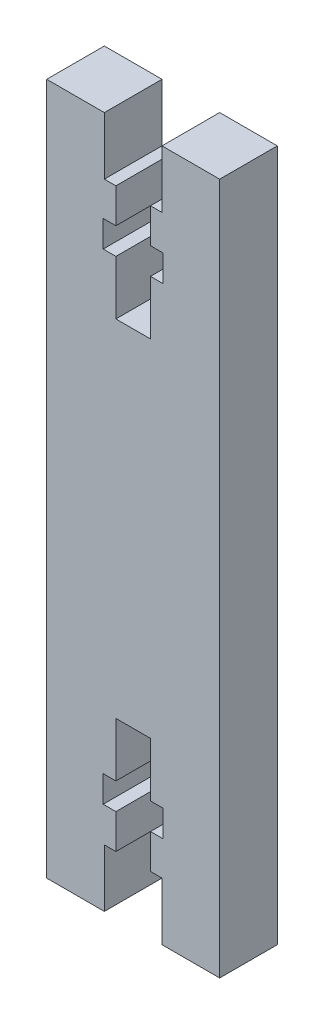
ISO-10303-21;
HEADER;
FILE_DESCRIPTION(('STEP AP214'),'2;1');
FILE_NAME('part.step','',(''),(''),'','','');
FILE_SCHEMA(('AUTOMOTIVE_DESIGN { 1 0 10303 214 1 1 1 1 }'));
ENDSEC;
DATA;
#1=APPLICATION_CONTEXT('core data for automotive mechanical design processes');
#2=APPLICATION_PROTOCOL_DEFINITION('international standard','automotive_design',2000,#1);
#3=PRODUCT_CONTEXT('',#1,'mechanical');
#4=PRODUCT('Part','Part','',(#3));
#5=PRODUCT_RELATED_PRODUCT_CATEGORY('part','',(#4));
#6=PRODUCT_DEFINITION_FORMATION('','',#4);
#7=PRODUCT_DEFINITION_CONTEXT('part definition',#1,'design');
#8=PRODUCT_DEFINITION('design','',#6,#7);
#9=PRODUCT_DEFINITION_SHAPE('','',#8);
#10=(LENGTH_UNIT() NAMED_UNIT(*) SI_UNIT(.MILLI.,.METRE.));
#11=(NAMED_UNIT(*) PLANE_ANGLE_UNIT() SI_UNIT($,.RADIAN.));
#12=(NAMED_UNIT(*) SI_UNIT($,.STERADIAN.) SOLID_ANGLE_UNIT());
#13=UNCERTAINTY_MEASURE_WITH_UNIT(LENGTH_MEASURE(1.E-05),#10,'distance_accuracy_value','');
#14=(GEOMETRIC_REPRESENTATION_CONTEXT(3) GLOBAL_UNCERTAINTY_ASSIGNED_CONTEXT((#13)) GLOBAL_UNIT_ASSIGNED_CONTEXT((#10,
#11,#12)) REPRESENTATION_CONTEXT('',''));
#15=CARTESIAN_POINT('',(0.,0.,0.));
#16=DIRECTION('',(0.,0.,1.));
#17=DIRECTION('',(1.,0.,0.));
#18=AXIS2_PLACEMENT_3D('',#15,#16,#17);
#19=CARTESIAN_POINT('',(-7.50000000000001,0.,5.));
#20=DIRECTION('',(-1.,0.,0.));
#21=DIRECTION('',(0.,0.,1.));
#22=AXIS2_PLACEMENT_3D('',#19,#20,#21);
#23=PLANE('',#22);
#24=DIRECTION('',(0.,1.,0.));
#25=VECTOR('',#24,1.);
#26=CARTESIAN_POINT('',(-7.50000000000001,0.,0.));
#27=LINE('',#26,#25);
#28=CARTESIAN_POINT('',(-7.5,-5.,0.));
#29=VERTEX_POINT('',#28);
#30=CARTESIAN_POINT('',(-7.49999999999998,55.,0.));
#31=VERTEX_POINT('',#30);
#32=EDGE_CURVE('E297',#29,#31,#27,.T.);
#33=ORIENTED_EDGE('',*,*,#32,.F.);
#34=DIRECTION('',(0.,0.,-1.));
#35=VECTOR('',#34,1.);
#36=CARTESIAN_POINT('',(-7.5,-5.,5.));
#37=LINE('',#36,#35);
#38=CARTESIAN_POINT('',(-7.5,-5.,5.));
#39=VERTEX_POINT('',#38);
#40=EDGE_CURVE('E11',#39,#29,#37,.T.);
#41=ORIENTED_EDGE('',*,*,#40,.F.);
#42=DIRECTION('',(0.,1.,0.));
#43=VECTOR('',#42,1.);
#44=CARTESIAN_POINT('',(-7.50000000000001,0.,5.));
#45=LINE('',#44,#43);
#46=CARTESIAN_POINT('',(-7.49999999999998,55.,5.));
#47=VERTEX_POINT('',#46);
#48=EDGE_CURVE('E391',#39,#47,#45,.T.);
#49=ORIENTED_EDGE('',*,*,#48,.T.);
#50=DIRECTION('',(0.,0.,-1.));
#51=VECTOR('',#50,1.);
#52=CARTESIAN_POINT('',(-7.49999999999998,55.,5.));
#53=LINE('',#52,#51);
#54=EDGE_CURVE('E169',#47,#31,#53,.T.);
#55=ORIENTED_EDGE('',*,*,#54,.T.);
#56=EDGE_LOOP('',(#33,#41,#49,#55));
#57=FACE_BOUND('',#56,.T.);
#58=ADVANCED_FACE('F35',(#57),#23,.T.);
#59=CARTESIAN_POINT('',(0.,-5.,5.));
#60=DIRECTION('',(0.,-1.,0.));
#61=DIRECTION('',(1.,0.,0.));
#62=AXIS2_PLACEMENT_3D('',#59,#60,#61);
#63=PLANE('',#62);
#64=DIRECTION('',(-1.,0.,0.));
#65=VECTOR('',#64,1.);
#66=CARTESIAN_POINT('',(0.,-5.,0.));
#67=LINE('',#66,#65);
#68=CARTESIAN_POINT('',(-2.5,-5.,0.));
#69=VERTEX_POINT('',#68);
#70=EDGE_CURVE('E300',#69,#29,#67,.T.);
#71=ORIENTED_EDGE('',*,*,#70,.F.);
#72=DIRECTION('',(0.,0.,-1.));
#73=VECTOR('',#72,1.);
#74=CARTESIAN_POINT('',(-2.5,-5.,5.));
#75=LINE('',#74,#73);
#76=CARTESIAN_POINT('',(-2.5,-5.,5.));
#77=VERTEX_POINT('',#76);
#78=EDGE_CURVE('E43',#77,#69,#75,.T.);
#79=ORIENTED_EDGE('',*,*,#78,.F.);
#80=DIRECTION('',(-1.,0.,0.));
#81=VECTOR('',#80,1.);
#82=CARTESIAN_POINT('',(0.,-5.,5.));
#83=LINE('',#82,#81);
#84=EDGE_CURVE('E477',#77,#39,#83,.T.);
#85=ORIENTED_EDGE('',*,*,#84,.T.);
#86=ORIENTED_EDGE('',*,*,#40,.T.);
#87=EDGE_LOOP('',(#71,#79,#85,#86));
#88=FACE_BOUND('',#87,.T.);
#89=ADVANCED_FACE('F476',(#88),#63,.T.);
#90=CARTESIAN_POINT('',(-2.5,0.,5.));
#91=DIRECTION('',(-1.,0.,0.));
#92=DIRECTION('',(0.,-1.,0.));
#93=AXIS2_PLACEMENT_3D('',#90,#91,#92);
#94=PLANE('',#93);
#95=DIRECTION('',(0.,1.,0.));
#96=VECTOR('',#95,1.);
#97=CARTESIAN_POINT('',(-2.5,0.,0.));
#98=LINE('',#97,#96);
#99=CARTESIAN_POINT('',(-2.5,0.,0.));
#100=VERTEX_POINT('',#99);
#101=EDGE_CURVE('E303',#69,#100,#98,.T.);
#102=ORIENTED_EDGE('',*,*,#101,.T.);
#103=DIRECTION('',(0.,0.,-1.));
#104=VECTOR('',#103,1.);
#105=CARTESIAN_POINT('',(-2.5,0.,5.));
#106=LINE('',#105,#104);
#107=CARTESIAN_POINT('',(-2.5,0.,5.));
#108=VERTEX_POINT('',#107);
#109=EDGE_CURVE('E462',#108,#100,#106,.T.);
#110=ORIENTED_EDGE('',*,*,#109,.F.);
#111=DIRECTION('',(0.,1.,0.));
#112=VECTOR('',#111,1.);
#113=CARTESIAN_POINT('',(-2.5,0.,5.));
#114=LINE('',#113,#112);
#115=EDGE_CURVE('E468',#77,#108,#114,.T.);
#116=ORIENTED_EDGE('',*,*,#115,.F.);
#117=ORIENTED_EDGE('',*,*,#78,.T.);
#118=EDGE_LOOP('',(#102,#110,#116,#117));
#119=FACE_BOUND('',#118,.T.);
#120=ADVANCED_FACE('F466',(#119),#94,.F.);
#121=CARTESIAN_POINT('',(0.,0.,5.));
#122=DIRECTION('',(0.,-1.,0.));
#123=DIRECTION('',(1.,0.,0.));
#124=AXIS2_PLACEMENT_3D('',#121,#122,#123);
#125=PLANE('',#124);
#126=DIRECTION('',(-1.,0.,0.));
#127=VECTOR('',#126,1.);
#128=CARTESIAN_POINT('',(0.,0.,0.));
#129=LINE('',#128,#127);
#130=CARTESIAN_POINT('',(-1.5,0.,0.));
#131=VERTEX_POINT('',#130);
#132=EDGE_CURVE('E306',#131,#100,#129,.T.);
#133=ORIENTED_EDGE('',*,*,#132,.F.);
#134=DIRECTION('',(0.,0.,-1.));
#135=VECTOR('',#134,1.);
#136=CARTESIAN_POINT('',(-1.5,0.,5.));
#137=LINE('',#136,#135);
#138=CARTESIAN_POINT('',(-1.5,0.,5.));
#139=VERTEX_POINT('',#138);
#140=EDGE_CURVE('E460',#139,#131,#137,.T.);
#141=ORIENTED_EDGE('',*,*,#140,.F.);
#142=DIRECTION('',(-1.,0.,0.));
#143=VECTOR('',#142,1.);
#144=CARTESIAN_POINT('',(0.,0.,5.));
#145=LINE('',#144,#143);
#146=EDGE_CURVE('E483',#139,#108,#145,.T.);
#147=ORIENTED_EDGE('',*,*,#146,.T.);
#148=ORIENTED_EDGE('',*,*,#109,.T.);
#149=EDGE_LOOP('',(#133,#141,#147,#148));
#150=FACE_BOUND('',#149,.T.);
#151=ADVANCED_FACE('F582',(#150),#125,.T.);
#152=CARTESIAN_POINT('',(-1.5,0.,5.));
#153=DIRECTION('',(1.,0.,0.));
#154=DIRECTION('',(0.,1.,0.));
#155=AXIS2_PLACEMENT_3D('',#152,#153,#154);
#156=PLANE('',#155);
#157=DIRECTION('',(0.,-1.,0.));
#158=VECTOR('',#157,1.);
#159=CARTESIAN_POINT('',(-1.5,0.,0.));
#160=LINE('',#159,#158);
#161=CARTESIAN_POINT('',(-1.5,3.00000000000001,0.));
#162=VERTEX_POINT('',#161);
#163=EDGE_CURVE('E309',#162,#131,#160,.T.);
#164=ORIENTED_EDGE('',*,*,#163,.F.);
#165=DIRECTION('',(0.,0.,-1.));
#166=VECTOR('',#165,1.);
#167=CARTESIAN_POINT('',(-1.5,3.00000000000001,5.));
#168=LINE('',#167,#166);
#169=CARTESIAN_POINT('',(-1.5,3.00000000000001,5.));
#170=VERTEX_POINT('',#169);
#171=EDGE_CURVE('E458',#170,#162,#168,.T.);
#172=ORIENTED_EDGE('',*,*,#171,.F.);
#173=DIRECTION('',(0.,-1.,0.));
#174=VECTOR('',#173,1.);
#175=CARTESIAN_POINT('',(-1.5,0.,5.));
#176=LINE('',#175,#174);
#177=EDGE_CURVE('E486',#170,#139,#176,.T.);
#178=ORIENTED_EDGE('',*,*,#177,.T.);
#179=ORIENTED_EDGE('',*,*,#140,.T.);
#180=EDGE_LOOP('',(#164,#172,#178,#179));
#181=FACE_BOUND('',#180,.T.);
#182=ADVANCED_FACE('F587',(#181),#156,.T.);
#183=CARTESIAN_POINT('',(0.,3.,5.));
#184=DIRECTION('',(0.,-1.,0.));
#185=DIRECTION('',(1.,0.,0.));
#186=AXIS2_PLACEMENT_3D('',#183,#184,#185);
#187=PLANE('',#186);
#188=DIRECTION('',(-1.,0.,0.));
#189=VECTOR('',#188,1.);
#190=CARTESIAN_POINT('',(0.,3.,0.));
#191=LINE('',#190,#189);
#192=CARTESIAN_POINT('',(-2.6,3.00000000000001,0.));
#193=VERTEX_POINT('',#192);
#194=EDGE_CURVE('E312',#162,#193,#191,.T.);
#195=ORIENTED_EDGE('',*,*,#194,.T.);
#196=DIRECTION('',(0.,0.,-1.));
#197=VECTOR('',#196,1.);
#198=CARTESIAN_POINT('',(-2.6,3.00000000000001,5.));
#199=LINE('',#198,#197);
#200=CARTESIAN_POINT('',(-2.6,3.00000000000001,5.));
#201=VERTEX_POINT('',#200);
#202=EDGE_CURVE('E455',#201,#193,#199,.T.);
#203=ORIENTED_EDGE('',*,*,#202,.F.);
#204=DIRECTION('',(-1.,0.,0.));
#205=VECTOR('',#204,1.);
#206=CARTESIAN_POINT('',(0.,3.,5.));
#207=LINE('',#206,#205);
#208=EDGE_CURVE('E489',#170,#201,#207,.T.);
#209=ORIENTED_EDGE('',*,*,#208,.F.);
#210=ORIENTED_EDGE('',*,*,#171,.T.);
#211=EDGE_LOOP('',(#195,#203,#209,#210));
#212=FACE_BOUND('',#211,.T.);
#213=ADVANCED_FACE('F591',(#212),#187,.F.);
#214=CARTESIAN_POINT('',(-2.6,0.,5.));
#215=DIRECTION('',(-1.,0.,0.));
#216=DIRECTION('',(0.,-1.,0.));
#217=AXIS2_PLACEMENT_3D('',#214,#215,#216);
#218=PLANE('',#217);
#219=DIRECTION('',(0.,1.,0.));
#220=VECTOR('',#219,1.);
#221=CARTESIAN_POINT('',(-2.6,0.,0.));
#222=LINE('',#221,#220);
#223=CARTESIAN_POINT('',(-2.6,5.3,0.));
#224=VERTEX_POINT('',#223);
#225=EDGE_CURVE('E314',#193,#224,#222,.T.);
#226=ORIENTED_EDGE('',*,*,#225,.T.);
#227=DIRECTION('',(0.,0.,-1.));
#228=VECTOR('',#227,1.);
#229=CARTESIAN_POINT('',(-2.6,5.3,5.));
#230=LINE('',#229,#228);
#231=CARTESIAN_POINT('',(-2.6,5.3,5.));
#232=VERTEX_POINT('',#231);
#233=EDGE_CURVE('E452',#232,#224,#230,.T.);
#234=ORIENTED_EDGE('',*,*,#233,.F.);
#235=DIRECTION('',(0.,1.,0.));
#236=VECTOR('',#235,1.);
#237=CARTESIAN_POINT('',(-2.6,0.,5.));
#238=LINE('',#237,#236);
#239=EDGE_CURVE('E491',#201,#232,#238,.T.);
#240=ORIENTED_EDGE('',*,*,#239,.F.);
#241=ORIENTED_EDGE('',*,*,#202,.T.);
#242=EDGE_LOOP('',(#226,#234,#240,#241));
#243=FACE_BOUND('',#242,.T.);
#244=ADVANCED_FACE('F595',(#243),#218,.F.);
#245=CARTESIAN_POINT('',(0.,5.29999999999999,5.));
#246=DIRECTION('',(0.,1.,0.));
#247=DIRECTION('',(-1.,0.,0.));
#248=AXIS2_PLACEMENT_3D('',#245,#246,#247);
#249=PLANE('',#248);
#250=DIRECTION('',(1.,0.,0.));
#251=VECTOR('',#250,1.);
#252=CARTESIAN_POINT('',(0.,5.29999999999999,0.));
#253=LINE('',#252,#251);
#254=CARTESIAN_POINT('',(-1.5,5.3,0.));
#255=VERTEX_POINT('',#254);
#256=EDGE_CURVE('E316',#224,#255,#253,.T.);
#257=ORIENTED_EDGE('',*,*,#256,.T.);
#258=DIRECTION('',(0.,0.,-1.));
#259=VECTOR('',#258,1.);
#260=CARTESIAN_POINT('',(-1.5,5.3,5.));
#261=LINE('',#260,#259);
#262=CARTESIAN_POINT('',(-1.5,5.3,5.));
#263=VERTEX_POINT('',#262);
#264=EDGE_CURVE('E450',#263,#255,#261,.T.);
#265=ORIENTED_EDGE('',*,*,#264,.F.);
#266=DIRECTION('',(1.,0.,0.));
#267=VECTOR('',#266,1.);
#268=CARTESIAN_POINT('',(0.,5.29999999999999,5.));
#269=LINE('',#268,#267);
#270=EDGE_CURVE('E493',#232,#263,#269,.T.);
#271=ORIENTED_EDGE('',*,*,#270,.F.);
#272=ORIENTED_EDGE('',*,*,#233,.T.);
#273=EDGE_LOOP('',(#257,#265,#271,#272));
#274=FACE_BOUND('',#273,.T.);
#275=ADVANCED_FACE('F599',(#274),#249,.F.);
#276=CARTESIAN_POINT('',(-1.5,0.,5.));
#277=DIRECTION('',(1.,0.,0.));
#278=DIRECTION('',(0.,1.,0.));
#279=AXIS2_PLACEMENT_3D('',#276,#277,#278);
#280=PLANE('',#279);
#281=DIRECTION('',(0.,-1.,0.));
#282=VECTOR('',#281,1.);
#283=CARTESIAN_POINT('',(-1.5,0.,0.));
#284=LINE('',#283,#282);
#285=CARTESIAN_POINT('',(-1.5,10.,0.));
#286=VERTEX_POINT('',#285);
#287=EDGE_CURVE('E319',#286,#255,#284,.T.);
#288=ORIENTED_EDGE('',*,*,#287,.F.);
#289=DIRECTION('',(0.,0.,-1.));
#290=VECTOR('',#289,1.);
#291=CARTESIAN_POINT('',(-1.5,10.,5.));
#292=LINE('',#291,#290);
#293=CARTESIAN_POINT('',(-1.5,10.,5.));
#294=VERTEX_POINT('',#293);
#295=EDGE_CURVE('E448',#294,#286,#292,.T.);
#296=ORIENTED_EDGE('',*,*,#295,.F.);
#297=DIRECTION('',(0.,-1.,0.));
#298=VECTOR('',#297,1.);
#299=CARTESIAN_POINT('',(-1.5,0.,5.));
#300=LINE('',#299,#298);
#301=EDGE_CURVE('E495',#294,#263,#300,.T.);
#302=ORIENTED_EDGE('',*,*,#301,.T.);
#303=ORIENTED_EDGE('',*,*,#264,.T.);
#304=EDGE_LOOP('',(#288,#296,#302,#303));
#305=FACE_BOUND('',#304,.T.);
#306=ADVANCED_FACE('F603',(#305),#280,.T.);
#307=CARTESIAN_POINT('',(0.,10.,5.));
#308=DIRECTION('',(0.,-1.,0.));
#309=DIRECTION('',(0.,0.,-1.));
#310=AXIS2_PLACEMENT_3D('',#307,#308,#309);
#311=PLANE('',#310);
#312=DIRECTION('',(-1.,0.,0.));
#313=VECTOR('',#312,1.);
#314=CARTESIAN_POINT('',(0.,10.,0.));
#315=LINE('',#314,#313);
#316=CARTESIAN_POINT('',(1.5,10.,0.));
#317=VERTEX_POINT('',#316);
#318=EDGE_CURVE('E322',#317,#286,#315,.T.);
#319=ORIENTED_EDGE('',*,*,#318,.F.);
#320=DIRECTION('',(0.,0.,-1.));
#321=VECTOR('',#320,1.);
#322=CARTESIAN_POINT('',(1.5,10.,5.));
#323=LINE('',#322,#321);
#324=CARTESIAN_POINT('',(1.5,10.,5.));
#325=VERTEX_POINT('',#324);
#326=EDGE_CURVE('E446',#325,#317,#323,.T.);
#327=ORIENTED_EDGE('',*,*,#326,.F.);
#328=DIRECTION('',(-1.,0.,0.));
#329=VECTOR('',#328,1.);
#330=CARTESIAN_POINT('',(0.,10.,5.));
#331=LINE('',#330,#329);
#332=EDGE_CURVE('E498',#325,#294,#331,.T.);
#333=ORIENTED_EDGE('',*,*,#332,.T.);
#334=ORIENTED_EDGE('',*,*,#295,.T.);
#335=EDGE_LOOP('',(#319,#327,#333,#334));
#336=FACE_BOUND('',#335,.T.);
#337=ADVANCED_FACE('F607',(#336),#311,.T.);
#338=CARTESIAN_POINT('',(1.5,0.,5.));
#339=DIRECTION('',(-1.,0.,0.));
#340=DIRECTION('',(0.,-1.,0.));
#341=AXIS2_PLACEMENT_3D('',#338,#339,#340);
#342=PLANE('',#341);
#343=DIRECTION('',(0.,1.,0.));
#344=VECTOR('',#343,1.);
#345=CARTESIAN_POINT('',(1.5,0.,0.));
#346=LINE('',#345,#344);
#347=CARTESIAN_POINT('',(1.5,5.3,0.));
#348=VERTEX_POINT('',#347);
#349=EDGE_CURVE('E325',#348,#317,#346,.T.);
#350=ORIENTED_EDGE('',*,*,#349,.F.);
#351=DIRECTION('',(0.,0.,-1.));
#352=VECTOR('',#351,1.);
#353=CARTESIAN_POINT('',(1.5,5.3,5.));
#354=LINE('',#353,#352);
#355=CARTESIAN_POINT('',(1.5,5.3,5.));
#356=VERTEX_POINT('',#355);
#357=EDGE_CURVE('E444',#356,#348,#354,.T.);
#358=ORIENTED_EDGE('',*,*,#357,.F.);
#359=DIRECTION('',(0.,1.,0.));
#360=VECTOR('',#359,1.);
#361=CARTESIAN_POINT('',(1.5,0.,5.));
#362=LINE('',#361,#360);
#363=EDGE_CURVE('E501',#356,#325,#362,.T.);
#364=ORIENTED_EDGE('',*,*,#363,.T.);
#365=ORIENTED_EDGE('',*,*,#326,.T.);
#366=EDGE_LOOP('',(#350,#358,#364,#365));
#367=FACE_BOUND('',#366,.T.);
#368=ADVANCED_FACE('F611',(#367),#342,.T.);
#369=CARTESIAN_POINT('',(0.,5.29999999999999,5.));
#370=DIRECTION('',(0.,1.,0.));
#371=DIRECTION('',(-1.,0.,0.));
#372=AXIS2_PLACEMENT_3D('',#369,#370,#371);
#373=PLANE('',#372);
#374=DIRECTION('',(1.,0.,0.));
#375=VECTOR('',#374,1.);
#376=CARTESIAN_POINT('',(0.,5.29999999999999,0.));
#377=LINE('',#376,#375);
#378=CARTESIAN_POINT('',(2.6,5.3,0.));
#379=VERTEX_POINT('',#378);
#380=EDGE_CURVE('E328',#348,#379,#377,.T.);
#381=ORIENTED_EDGE('',*,*,#380,.T.);
#382=DIRECTION('',(0.,0.,-1.));
#383=VECTOR('',#382,1.);
#384=CARTESIAN_POINT('',(2.6,5.3,5.));
#385=LINE('',#384,#383);
#386=CARTESIAN_POINT('',(2.6,5.3,5.));
#387=VERTEX_POINT('',#386);
#388=EDGE_CURVE('E441',#387,#379,#385,.T.);
#389=ORIENTED_EDGE('',*,*,#388,.F.);
#390=DIRECTION('',(1.,0.,0.));
#391=VECTOR('',#390,1.);
#392=CARTESIAN_POINT('',(0.,5.29999999999999,5.));
#393=LINE('',#392,#391);
#394=EDGE_CURVE('E504',#356,#387,#393,.T.);
#395=ORIENTED_EDGE('',*,*,#394,.F.);
#396=ORIENTED_EDGE('',*,*,#357,.T.);
#397=EDGE_LOOP('',(#381,#389,#395,#396));
#398=FACE_BOUND('',#397,.T.);
#399=ADVANCED_FACE('F615',(#398),#373,.F.);
#400=CARTESIAN_POINT('',(2.6,0.,5.));
#401=DIRECTION('',(1.,0.,0.));
#402=DIRECTION('',(0.,1.,0.));
#403=AXIS2_PLACEMENT_3D('',#400,#401,#402);
#404=PLANE('',#403);
#405=DIRECTION('',(0.,-1.,0.));
#406=VECTOR('',#405,1.);
#407=CARTESIAN_POINT('',(2.6,0.,0.));
#408=LINE('',#407,#406);
#409=CARTESIAN_POINT('',(2.6,3.00000000000001,0.));
#410=VERTEX_POINT('',#409);
#411=EDGE_CURVE('E330',#379,#410,#408,.T.);
#412=ORIENTED_EDGE('',*,*,#411,.T.);
#413=DIRECTION('',(0.,0.,-1.));
#414=VECTOR('',#413,1.);
#415=CARTESIAN_POINT('',(2.6,3.00000000000001,5.));
#416=LINE('',#415,#414);
#417=CARTESIAN_POINT('',(2.6,3.00000000000001,5.));
#418=VERTEX_POINT('',#417);
#419=EDGE_CURVE('E438',#418,#410,#416,.T.);
#420=ORIENTED_EDGE('',*,*,#419,.F.);
#421=DIRECTION('',(0.,-1.,0.));
#422=VECTOR('',#421,1.);
#423=CARTESIAN_POINT('',(2.6,0.,5.));
#424=LINE('',#423,#422);
#425=EDGE_CURVE('E506',#387,#418,#424,.T.);
#426=ORIENTED_EDGE('',*,*,#425,.F.);
#427=ORIENTED_EDGE('',*,*,#388,.T.);
#428=EDGE_LOOP('',(#412,#420,#426,#427));
#429=FACE_BOUND('',#428,.T.);
#430=ADVANCED_FACE('F619',(#429),#404,.F.);
#431=CARTESIAN_POINT('',(0.,3.00000000000001,5.));
#432=DIRECTION('',(0.,-1.,0.));
#433=DIRECTION('',(0.,0.,-1.));
#434=AXIS2_PLACEMENT_3D('',#431,#432,#433);
#435=PLANE('',#434);
#436=DIRECTION('',(-1.,0.,0.));
#437=VECTOR('',#436,1.);
#438=CARTESIAN_POINT('',(0.,3.00000000000001,0.));
#439=LINE('',#438,#437);
#440=CARTESIAN_POINT('',(1.5,3.00000000000001,0.));
#441=VERTEX_POINT('',#440);
#442=EDGE_CURVE('E332',#410,#441,#439,.T.);
#443=ORIENTED_EDGE('',*,*,#442,.T.);
#444=DIRECTION('',(0.,0.,-1.));
#445=VECTOR('',#444,1.);
#446=CARTESIAN_POINT('',(1.5,3.00000000000001,5.));
#447=LINE('',#446,#445);
#448=CARTESIAN_POINT('',(1.5,3.00000000000001,5.));
#449=VERTEX_POINT('',#448);
#450=EDGE_CURVE('E436',#449,#441,#447,.T.);
#451=ORIENTED_EDGE('',*,*,#450,.F.);
#452=DIRECTION('',(-1.,0.,0.));
#453=VECTOR('',#452,1.);
#454=CARTESIAN_POINT('',(0.,3.00000000000001,5.));
#455=LINE('',#454,#453);
#456=EDGE_CURVE('E508',#418,#449,#455,.T.);
#457=ORIENTED_EDGE('',*,*,#456,.F.);
#458=ORIENTED_EDGE('',*,*,#419,.T.);
#459=EDGE_LOOP('',(#443,#451,#457,#458));
#460=FACE_BOUND('',#459,.T.);
#461=ADVANCED_FACE('F623',(#460),#435,.F.);
#462=CARTESIAN_POINT('',(1.5,0.,5.));
#463=DIRECTION('',(-1.,0.,0.));
#464=DIRECTION('',(0.,0.,1.));
#465=AXIS2_PLACEMENT_3D('',#462,#463,#464);
#466=PLANE('',#465);
#467=DIRECTION('',(0.,1.,0.));
#468=VECTOR('',#467,1.);
#469=CARTESIAN_POINT('',(1.5,0.,0.));
#470=LINE('',#469,#468);
#471=CARTESIAN_POINT('',(1.5,0.,0.));
#472=VERTEX_POINT('',#471);
#473=EDGE_CURVE('E335',#472,#441,#470,.T.);
#474=ORIENTED_EDGE('',*,*,#473,.F.);
#475=DIRECTION('',(0.,0.,-1.));
#476=VECTOR('',#475,1.);
#477=CARTESIAN_POINT('',(1.5,0.,5.));
#478=LINE('',#477,#476);
#479=CARTESIAN_POINT('',(1.5,0.,5.));
#480=VERTEX_POINT('',#479);
#481=EDGE_CURVE('E434',#480,#472,#478,.T.);
#482=ORIENTED_EDGE('',*,*,#481,.F.);
#483=DIRECTION('',(0.,1.,0.));
#484=VECTOR('',#483,1.);
#485=CARTESIAN_POINT('',(1.5,0.,5.));
#486=LINE('',#485,#484);
#487=EDGE_CURVE('E510',#480,#449,#486,.T.);
#488=ORIENTED_EDGE('',*,*,#487,.T.);
#489=ORIENTED_EDGE('',*,*,#450,.T.);
#490=EDGE_LOOP('',(#474,#482,#488,#489));
#491=FACE_BOUND('',#490,.T.);
#492=ADVANCED_FACE('F627',(#491),#466,.T.);
#493=CARTESIAN_POINT('',(0.,0.,5.));
#494=DIRECTION('',(0.,1.,0.));
#495=DIRECTION('',(-1.,0.,0.));
#496=AXIS2_PLACEMENT_3D('',#493,#494,#495);
#497=PLANE('',#496);
#498=DIRECTION('',(1.,0.,0.));
#499=VECTOR('',#498,1.);
#500=CARTESIAN_POINT('',(0.,0.,0.));
#501=LINE('',#500,#499);
#502=CARTESIAN_POINT('',(2.5,0.,0.));
#503=VERTEX_POINT('',#502);
#504=EDGE_CURVE('E338',#472,#503,#501,.T.);
#505=ORIENTED_EDGE('',*,*,#504,.T.);
#506=DIRECTION('',(0.,0.,-1.));
#507=VECTOR('',#506,1.);
#508=CARTESIAN_POINT('',(2.5,0.,5.));
#509=LINE('',#508,#507);
#510=CARTESIAN_POINT('',(2.5,0.,5.));
#511=VERTEX_POINT('',#510);
#512=EDGE_CURVE('E431',#511,#503,#509,.T.);
#513=ORIENTED_EDGE('',*,*,#512,.F.);
#514=DIRECTION('',(1.,0.,0.));
#515=VECTOR('',#514,1.);
#516=CARTESIAN_POINT('',(0.,0.,5.));
#517=LINE('',#516,#515);
#518=EDGE_CURVE('E513',#480,#511,#517,.T.);
#519=ORIENTED_EDGE('',*,*,#518,.F.);
#520=ORIENTED_EDGE('',*,*,#481,.T.);
#521=EDGE_LOOP('',(#505,#513,#519,#520));
#522=FACE_BOUND('',#521,.T.);
#523=ADVANCED_FACE('F631',(#522),#497,.F.);
#524=CARTESIAN_POINT('',(2.5,0.,5.));
#525=DIRECTION('',(1.,0.,0.));
#526=DIRECTION('',(0.,0.,-1.));
#527=AXIS2_PLACEMENT_3D('',#524,#525,#526);
#528=PLANE('',#527);
#529=DIRECTION('',(0.,-1.,0.));
#530=VECTOR('',#529,1.);
#531=CARTESIAN_POINT('',(2.5,0.,0.));
#532=LINE('',#531,#530);
#533=CARTESIAN_POINT('',(2.5,-5.,0.));
#534=VERTEX_POINT('',#533);
#535=EDGE_CURVE('E340',#503,#534,#532,.T.);
#536=ORIENTED_EDGE('',*,*,#535,.T.);
#537=DIRECTION('',(0.,0.,-1.));
#538=VECTOR('',#537,1.);
#539=CARTESIAN_POINT('',(2.5,-5.,5.));
#540=LINE('',#539,#538);
#541=CARTESIAN_POINT('',(2.5,-5.,5.));
#542=VERTEX_POINT('',#541);
#543=EDGE_CURVE('E428',#542,#534,#540,.T.);
#544=ORIENTED_EDGE('',*,*,#543,.F.);
#545=DIRECTION('',(0.,-1.,0.));
#546=VECTOR('',#545,1.);
#547=CARTESIAN_POINT('',(2.5,0.,5.));
#548=LINE('',#547,#546);
#549=EDGE_CURVE('E515',#511,#542,#548,.T.);
#550=ORIENTED_EDGE('',*,*,#549,.F.);
#551=ORIENTED_EDGE('',*,*,#512,.T.);
#552=EDGE_LOOP('',(#536,#544,#550,#551));
#553=FACE_BOUND('',#552,.T.);
#554=ADVANCED_FACE('F635',(#553),#528,.F.);
#555=CARTESIAN_POINT('',(0.,-5.,5.));
#556=DIRECTION('',(0.,1.,0.));
#557=DIRECTION('',(-1.,0.,0.));
#558=AXIS2_PLACEMENT_3D('',#555,#556,#557);
#559=PLANE('',#558);
#560=DIRECTION('',(1.,0.,0.));
#561=VECTOR('',#560,1.);
#562=CARTESIAN_POINT('',(0.,-5.,0.));
#563=LINE('',#562,#561);
#564=CARTESIAN_POINT('',(7.5,-5.,0.));
#565=VERTEX_POINT('',#564);
#566=EDGE_CURVE('E342',#534,#565,#563,.T.);
#567=ORIENTED_EDGE('',*,*,#566,.T.);
#568=DIRECTION('',(0.,0.,-1.));
#569=VECTOR('',#568,1.);
#570=CARTESIAN_POINT('',(7.5,-5.,5.));
#571=LINE('',#570,#569);
#572=CARTESIAN_POINT('',(7.5,-5.,5.));
#573=VERTEX_POINT('',#572);
#574=EDGE_CURVE('E425',#573,#565,#571,.T.);
#575=ORIENTED_EDGE('',*,*,#574,.F.);
#576=DIRECTION('',(1.,0.,0.));
#577=VECTOR('',#576,1.);
#578=CARTESIAN_POINT('',(0.,-5.,5.));
#579=LINE('',#578,#577);
#580=EDGE_CURVE('E517',#542,#573,#579,.T.);
#581=ORIENTED_EDGE('',*,*,#580,.F.);
#582=ORIENTED_EDGE('',*,*,#543,.T.);
#583=EDGE_LOOP('',(#567,#575,#581,#582));
#584=FACE_BOUND('',#583,.T.);
#585=ADVANCED_FACE('F639',(#584),#559,.F.);
#586=CARTESIAN_POINT('',(7.5,0.,5.));
#587=DIRECTION('',(-1.,0.,0.));
#588=DIRECTION('',(0.,-1.,0.));
#589=AXIS2_PLACEMENT_3D('',#586,#587,#588);
#590=PLANE('',#589);
#591=DIRECTION('',(0.,1.,0.));
#592=VECTOR('',#591,1.);
#593=CARTESIAN_POINT('',(7.5,0.,0.));
#594=LINE('',#593,#592);
#595=CARTESIAN_POINT('',(7.50000000000002,55.,0.));
#596=VERTEX_POINT('',#595);
#597=EDGE_CURVE('E344',#565,#596,#594,.T.);
#598=ORIENTED_EDGE('',*,*,#597,.T.);
#599=DIRECTION('',(0.,0.,-1.));
#600=VECTOR('',#599,1.);
#601=CARTESIAN_POINT('',(7.50000000000002,55.,5.));
#602=LINE('',#601,#600);
#603=CARTESIAN_POINT('',(7.50000000000002,55.,5.));
#604=VERTEX_POINT('',#603);
#605=EDGE_CURVE('E423',#604,#596,#602,.T.);
#606=ORIENTED_EDGE('',*,*,#605,.F.);
#607=DIRECTION('',(0.,1.,0.));
#608=VECTOR('',#607,1.);
#609=CARTESIAN_POINT('',(7.5,0.,5.));
#610=LINE('',#609,#608);
#611=EDGE_CURVE('E519',#573,#604,#610,.T.);
#612=ORIENTED_EDGE('',*,*,#611,.F.);
#613=ORIENTED_EDGE('',*,*,#574,.T.);
#614=EDGE_LOOP('',(#598,#606,#612,#613));
#615=FACE_BOUND('',#614,.T.);
#616=ADVANCED_FACE('F643',(#615),#590,.F.);
#617=CARTESIAN_POINT('',(0.,55.,5.));
#618=DIRECTION('',(0.,1.,0.));
#619=DIRECTION('',(0.,0.,1.));
#620=AXIS2_PLACEMENT_3D('',#617,#618,#619);
#621=PLANE('',#620);
#622=DIRECTION('',(1.,0.,0.));
#623=VECTOR('',#622,1.);
#624=CARTESIAN_POINT('',(0.,55.,0.));
#625=LINE('',#624,#623);
#626=CARTESIAN_POINT('',(2.50000000000002,55.,0.));
#627=VERTEX_POINT('',#626);
#628=EDGE_CURVE('E347',#627,#596,#625,.T.);
#629=ORIENTED_EDGE('',*,*,#628,.F.);
#630=DIRECTION('',(0.,0.,-1.));
#631=VECTOR('',#630,1.);
#632=CARTESIAN_POINT('',(2.50000000000002,55.,5.));
#633=LINE('',#632,#631);
#634=CARTESIAN_POINT('',(2.50000000000002,55.,5.));
#635=VERTEX_POINT('',#634);
#636=EDGE_CURVE('E421',#635,#627,#633,.T.);
#637=ORIENTED_EDGE('',*,*,#636,.F.);
#638=DIRECTION('',(1.,0.,0.));
#639=VECTOR('',#638,1.);
#640=CARTESIAN_POINT('',(0.,55.,5.));
#641=LINE('',#640,#639);
#642=EDGE_CURVE('E521',#635,#604,#641,.T.);
#643=ORIENTED_EDGE('',*,*,#642,.T.);
#644=ORIENTED_EDGE('',*,*,#605,.T.);
#645=EDGE_LOOP('',(#629,#637,#643,#644));
#646=FACE_BOUND('',#645,.T.);
#647=ADVANCED_FACE('F647',(#646),#621,.T.);
#648=CARTESIAN_POINT('',(2.50000000000002,0.,5.));
#649=DIRECTION('',(-1.,0.,0.));
#650=DIRECTION('',(0.,0.,1.));
#651=AXIS2_PLACEMENT_3D('',#648,#649,#650);
#652=PLANE('',#651);
#653=DIRECTION('',(0.,1.,0.));
#654=VECTOR('',#653,1.);
#655=CARTESIAN_POINT('',(2.50000000000002,0.,0.));
#656=LINE('',#655,#654);
#657=CARTESIAN_POINT('',(2.50000000000002,50.,0.));
#658=VERTEX_POINT('',#657);
#659=EDGE_CURVE('E350',#658,#627,#656,.T.);
#660=ORIENTED_EDGE('',*,*,#659,.F.);
#661=DIRECTION('',(0.,0.,-1.));
#662=VECTOR('',#661,1.);
#663=CARTESIAN_POINT('',(2.50000000000002,50.,5.));
#664=LINE('',#663,#662);
#665=CARTESIAN_POINT('',(2.50000000000002,50.,5.));
#666=VERTEX_POINT('',#665);
#667=EDGE_CURVE('E419',#666,#658,#664,.T.);
#668=ORIENTED_EDGE('',*,*,#667,.F.);
#669=DIRECTION('',(0.,1.,0.));
#670=VECTOR('',#669,1.);
#671=CARTESIAN_POINT('',(2.50000000000002,0.,5.));
#672=LINE('',#671,#670);
#673=EDGE_CURVE('E524',#666,#635,#672,.T.);
#674=ORIENTED_EDGE('',*,*,#673,.T.);
#675=ORIENTED_EDGE('',*,*,#636,.T.);
#676=EDGE_LOOP('',(#660,#668,#674,#675));
#677=FACE_BOUND('',#676,.T.);
#678=ADVANCED_FACE('F651',(#677),#652,.T.);
#679=CARTESIAN_POINT('',(0.,50.,5.));
#680=DIRECTION('',(0.,1.,0.));
#681=DIRECTION('',(0.,0.,1.));
#682=AXIS2_PLACEMENT_3D('',#679,#680,#681);
#683=PLANE('',#682);
#684=DIRECTION('',(1.,0.,0.));
#685=VECTOR('',#684,1.);
#686=CARTESIAN_POINT('',(0.,50.,0.));
#687=LINE('',#686,#685);
#688=CARTESIAN_POINT('',(1.50000000000002,50.,0.));
#689=VERTEX_POINT('',#688);
#690=EDGE_CURVE('E353',#689,#658,#687,.T.);
#691=ORIENTED_EDGE('',*,*,#690,.F.);
#692=DIRECTION('',(0.,0.,-1.));
#693=VECTOR('',#692,1.);
#694=CARTESIAN_POINT('',(1.50000000000002,50.,5.));
#695=LINE('',#694,#693);
#696=CARTESIAN_POINT('',(1.50000000000002,50.,5.));
#697=VERTEX_POINT('',#696);
#698=EDGE_CURVE('E417',#697,#689,#695,.T.);
#699=ORIENTED_EDGE('',*,*,#698,.F.);
#700=DIRECTION('',(1.,0.,0.));
#701=VECTOR('',#700,1.);
#702=CARTESIAN_POINT('',(0.,50.,5.));
#703=LINE('',#702,#701);
#704=EDGE_CURVE('E527',#697,#666,#703,.T.);
#705=ORIENTED_EDGE('',*,*,#704,.T.);
#706=ORIENTED_EDGE('',*,*,#667,.T.);
#707=EDGE_LOOP('',(#691,#699,#705,#706));
#708=FACE_BOUND('',#707,.T.);
#709=ADVANCED_FACE('F655',(#708),#683,.T.);
#710=CARTESIAN_POINT('',(1.50000000000002,0.,5.));
#711=DIRECTION('',(1.,0.,0.));
#712=DIRECTION('',(0.,0.,-1.));
#713=AXIS2_PLACEMENT_3D('',#710,#711,#712);
#714=PLANE('',#713);
#715=DIRECTION('',(0.,-1.,0.));
#716=VECTOR('',#715,1.);
#717=CARTESIAN_POINT('',(1.50000000000002,0.,0.));
#718=LINE('',#717,#716);
#719=CARTESIAN_POINT('',(1.50000000000002,47.,0.));
#720=VERTEX_POINT('',#719);
#721=EDGE_CURVE('E356',#689,#720,#718,.T.);
#722=ORIENTED_EDGE('',*,*,#721,.T.);
#723=DIRECTION('',(0.,0.,-1.));
#724=VECTOR('',#723,1.);
#725=CARTESIAN_POINT('',(1.50000000000002,47.,5.));
#726=LINE('',#725,#724);
#727=CARTESIAN_POINT('',(1.50000000000002,47.,5.));
#728=VERTEX_POINT('',#727);
#729=EDGE_CURVE('E415',#728,#720,#726,.T.);
#730=ORIENTED_EDGE('',*,*,#729,.F.);
#731=DIRECTION('',(0.,-1.,0.));
#732=VECTOR('',#731,1.);
#733=CARTESIAN_POINT('',(1.50000000000002,0.,5.));
#734=LINE('',#733,#732);
#735=EDGE_CURVE('E530',#697,#728,#734,.T.);
#736=ORIENTED_EDGE('',*,*,#735,.F.);
#737=ORIENTED_EDGE('',*,*,#698,.T.);
#738=EDGE_LOOP('',(#722,#730,#736,#737));
#739=FACE_BOUND('',#738,.T.);
#740=ADVANCED_FACE('F659',(#739),#714,.F.);
#741=CARTESIAN_POINT('',(0.,47.,5.));
#742=DIRECTION('',(0.,-1.,0.));
#743=DIRECTION('',(0.,0.,-1.));
#744=AXIS2_PLACEMENT_3D('',#741,#742,#743);
#745=PLANE('',#744);
#746=DIRECTION('',(-1.,0.,0.));
#747=VECTOR('',#746,1.);
#748=CARTESIAN_POINT('',(0.,47.,0.));
#749=LINE('',#748,#747);
#750=CARTESIAN_POINT('',(2.60000000000002,47.,0.));
#751=VERTEX_POINT('',#750);
#752=EDGE_CURVE('E359',#751,#720,#749,.T.);
#753=ORIENTED_EDGE('',*,*,#752,.F.);
#754=DIRECTION('',(0.,0.,-1.));
#755=VECTOR('',#754,1.);
#756=CARTESIAN_POINT('',(2.60000000000002,47.,5.));
#757=LINE('',#756,#755);
#758=CARTESIAN_POINT('',(2.60000000000002,47.,5.));
#759=VERTEX_POINT('',#758);
#760=EDGE_CURVE('E413',#759,#751,#757,.T.);
#761=ORIENTED_EDGE('',*,*,#760,.F.);
#762=DIRECTION('',(-1.,0.,0.));
#763=VECTOR('',#762,1.);
#764=CARTESIAN_POINT('',(0.,47.,5.));
#765=LINE('',#764,#763);
#766=EDGE_CURVE('E532',#759,#728,#765,.T.);
#767=ORIENTED_EDGE('',*,*,#766,.T.);
#768=ORIENTED_EDGE('',*,*,#729,.T.);
#769=EDGE_LOOP('',(#753,#761,#767,#768));
#770=FACE_BOUND('',#769,.T.);
#771=ADVANCED_FACE('F663',(#770),#745,.T.);
#772=CARTESIAN_POINT('',(2.60000000000006,0.,5.));
#773=DIRECTION('',(-1.,0.,0.));
#774=DIRECTION('',(0.,-1.,0.));
#775=AXIS2_PLACEMENT_3D('',#772,#773,#774);
#776=PLANE('',#775);
#777=DIRECTION('',(0.,1.,0.));
#778=VECTOR('',#777,1.);
#779=CARTESIAN_POINT('',(2.60000000000006,0.,0.));
#780=LINE('',#779,#778);
#781=CARTESIAN_POINT('',(2.60000000000002,44.7,0.));
#782=VERTEX_POINT('',#781);
#783=EDGE_CURVE('E362',#782,#751,#780,.T.);
#784=ORIENTED_EDGE('',*,*,#783,.F.);
#785=DIRECTION('',(0.,0.,-1.));
#786=VECTOR('',#785,1.);
#787=CARTESIAN_POINT('',(2.60000000000002,44.7,5.));
#788=LINE('',#787,#786);
#789=CARTESIAN_POINT('',(2.60000000000002,44.7,5.));
#790=VERTEX_POINT('',#789);
#791=EDGE_CURVE('E411',#790,#782,#788,.T.);
#792=ORIENTED_EDGE('',*,*,#791,.F.);
#793=DIRECTION('',(0.,1.,0.));
#794=VECTOR('',#793,1.);
#795=CARTESIAN_POINT('',(2.60000000000006,0.,5.));
#796=LINE('',#795,#794);
#797=EDGE_CURVE('E535',#790,#759,#796,.T.);
#798=ORIENTED_EDGE('',*,*,#797,.T.);
#799=ORIENTED_EDGE('',*,*,#760,.T.);
#800=EDGE_LOOP('',(#784,#792,#798,#799));
#801=FACE_BOUND('',#800,.T.);
#802=ADVANCED_FACE('F667',(#801),#776,.T.);
#803=CARTESIAN_POINT('',(2.8197141591332E-13,44.7,5.));
#804=DIRECTION('',(0.,1.,0.));
#805=DIRECTION('',(-1.,0.,0.));
#806=AXIS2_PLACEMENT_3D('',#803,#804,#805);
#807=PLANE('',#806);
#808=DIRECTION('',(1.,0.,0.));
#809=VECTOR('',#808,1.);
#810=CARTESIAN_POINT('',(2.8197141591332E-13,44.7,0.));
#811=LINE('',#810,#809);
#812=CARTESIAN_POINT('',(1.50000000000002,44.7,0.));
#813=VERTEX_POINT('',#812);
#814=EDGE_CURVE('E365',#813,#782,#811,.T.);
#815=ORIENTED_EDGE('',*,*,#814,.F.);
#816=DIRECTION('',(0.,0.,-1.));
#817=VECTOR('',#816,1.);
#818=CARTESIAN_POINT('',(1.50000000000002,44.7,5.));
#819=LINE('',#818,#817);
#820=CARTESIAN_POINT('',(1.50000000000002,44.7,5.));
#821=VERTEX_POINT('',#820);
#822=EDGE_CURVE('E409',#821,#813,#819,.T.);
#823=ORIENTED_EDGE('',*,*,#822,.F.);
#824=DIRECTION('',(1.,0.,0.));
#825=VECTOR('',#824,1.);
#826=CARTESIAN_POINT('',(2.8197141591332E-13,44.7,5.));
#827=LINE('',#826,#825);
#828=EDGE_CURVE('E538',#821,#790,#827,.T.);
#829=ORIENTED_EDGE('',*,*,#828,.T.);
#830=ORIENTED_EDGE('',*,*,#791,.T.);
#831=EDGE_LOOP('',(#815,#823,#829,#830));
#832=FACE_BOUND('',#831,.T.);
#833=ADVANCED_FACE('F671',(#832),#807,.T.);
#834=CARTESIAN_POINT('',(1.50000000000003,0.,5.));
#835=DIRECTION('',(1.,0.,0.));
#836=DIRECTION('',(0.,1.,0.));
#837=AXIS2_PLACEMENT_3D('',#834,#835,#836);
#838=PLANE('',#837);
#839=DIRECTION('',(0.,-1.,0.));
#840=VECTOR('',#839,1.);
#841=CARTESIAN_POINT('',(1.50000000000003,0.,0.));
#842=LINE('',#841,#840);
#843=CARTESIAN_POINT('',(1.50000000000002,40.,0.));
#844=VERTEX_POINT('',#843);
#845=EDGE_CURVE('E368',#813,#844,#842,.T.);
#846=ORIENTED_EDGE('',*,*,#845,.T.);
#847=DIRECTION('',(0.,0.,-1.));
#848=VECTOR('',#847,1.);
#849=CARTESIAN_POINT('',(1.50000000000002,40.,5.));
#850=LINE('',#849,#848);
#851=CARTESIAN_POINT('',(1.50000000000002,40.,5.));
#852=VERTEX_POINT('',#851);
#853=EDGE_CURVE('E406',#852,#844,#850,.T.);
#854=ORIENTED_EDGE('',*,*,#853,.F.);
#855=DIRECTION('',(0.,-1.,0.));
#856=VECTOR('',#855,1.);
#857=CARTESIAN_POINT('',(1.50000000000003,0.,5.));
#858=LINE('',#857,#856);
#859=EDGE_CURVE('E541',#821,#852,#858,.T.);
#860=ORIENTED_EDGE('',*,*,#859,.F.);
#861=ORIENTED_EDGE('',*,*,#822,.T.);
#862=EDGE_LOOP('',(#846,#854,#860,#861));
#863=FACE_BOUND('',#862,.T.);
#864=ADVANCED_FACE('F675',(#863),#838,.F.);
#865=CARTESIAN_POINT('',(0.,40.,5.));
#866=DIRECTION('',(0.,-1.,0.));
#867=DIRECTION('',(0.,0.,-1.));
#868=AXIS2_PLACEMENT_3D('',#865,#866,#867);
#869=PLANE('',#868);
#870=DIRECTION('',(-1.,0.,0.));
#871=VECTOR('',#870,1.);
#872=CARTESIAN_POINT('',(0.,40.,0.));
#873=LINE('',#872,#871);
#874=CARTESIAN_POINT('',(-1.49999999999998,40.,0.));
#875=VERTEX_POINT('',#874);
#876=EDGE_CURVE('E370',#844,#875,#873,.T.);
#877=ORIENTED_EDGE('',*,*,#876,.T.);
#878=DIRECTION('',(0.,0.,-1.));
#879=VECTOR('',#878,1.);
#880=CARTESIAN_POINT('',(-1.49999999999998,40.,5.));
#881=LINE('',#880,#879);
#882=CARTESIAN_POINT('',(-1.49999999999998,40.,5.));
#883=VERTEX_POINT('',#882);
#884=EDGE_CURVE('E403',#883,#875,#881,.T.);
#885=ORIENTED_EDGE('',*,*,#884,.F.);
#886=DIRECTION('',(-1.,0.,0.));
#887=VECTOR('',#886,1.);
#888=CARTESIAN_POINT('',(0.,40.,5.));
#889=LINE('',#888,#887);
#890=EDGE_CURVE('E543',#852,#883,#889,.T.);
#891=ORIENTED_EDGE('',*,*,#890,.F.);
#892=ORIENTED_EDGE('',*,*,#853,.T.);
#893=EDGE_LOOP('',(#877,#885,#891,#892));
#894=FACE_BOUND('',#893,.T.);
#895=ADVANCED_FACE('F679',(#894),#869,.F.);
#896=CARTESIAN_POINT('',(-1.5,0.,5.));
#897=DIRECTION('',(-1.,0.,0.));
#898=DIRECTION('',(0.,-1.,0.));
#899=AXIS2_PLACEMENT_3D('',#896,#897,#898);
#900=PLANE('',#899);
#901=DIRECTION('',(0.,1.,0.));
#902=VECTOR('',#901,1.);
#903=CARTESIAN_POINT('',(-1.5,0.,0.));
#904=LINE('',#903,#902);
#905=CARTESIAN_POINT('',(-1.49999999999998,44.7,0.));
#906=VERTEX_POINT('',#905);
#907=EDGE_CURVE('E372',#875,#906,#904,.T.);
#908=ORIENTED_EDGE('',*,*,#907,.T.);
#909=DIRECTION('',(0.,0.,-1.));
#910=VECTOR('',#909,1.);
#911=CARTESIAN_POINT('',(-1.49999999999998,44.7,5.));
#912=LINE('',#911,#910);
#913=CARTESIAN_POINT('',(-1.49999999999998,44.7,5.));
#914=VERTEX_POINT('',#913);
#915=EDGE_CURVE('E401',#914,#906,#912,.T.);
#916=ORIENTED_EDGE('',*,*,#915,.F.);
#917=DIRECTION('',(0.,1.,0.));
#918=VECTOR('',#917,1.);
#919=CARTESIAN_POINT('',(-1.5,0.,5.));
#920=LINE('',#919,#918);
#921=EDGE_CURVE('E545',#883,#914,#920,.T.);
#922=ORIENTED_EDGE('',*,*,#921,.F.);
#923=ORIENTED_EDGE('',*,*,#884,.T.);
#924=EDGE_LOOP('',(#908,#916,#922,#923));
#925=FACE_BOUND('',#924,.T.);
#926=ADVANCED_FACE('F683',(#925),#900,.F.);
#927=CARTESIAN_POINT('',(0.,44.7,5.));
#928=DIRECTION('',(0.,1.,0.));
#929=DIRECTION('',(0.,0.,1.));
#930=AXIS2_PLACEMENT_3D('',#927,#928,#929);
#931=PLANE('',#930);
#932=DIRECTION('',(1.,0.,0.));
#933=VECTOR('',#932,1.);
#934=CARTESIAN_POINT('',(0.,44.7,0.));
#935=LINE('',#934,#933);
#936=CARTESIAN_POINT('',(-2.59999999999998,44.7,0.));
#937=VERTEX_POINT('',#936);
#938=EDGE_CURVE('E375',#937,#906,#935,.T.);
#939=ORIENTED_EDGE('',*,*,#938,.F.);
#940=DIRECTION('',(0.,0.,-1.));
#941=VECTOR('',#940,1.);
#942=CARTESIAN_POINT('',(-2.59999999999998,44.7,5.));
#943=LINE('',#942,#941);
#944=CARTESIAN_POINT('',(-2.59999999999998,44.7,5.));
#945=VERTEX_POINT('',#944);
#946=EDGE_CURVE('E399',#945,#937,#943,.T.);
#947=ORIENTED_EDGE('',*,*,#946,.F.);
#948=DIRECTION('',(1.,0.,0.));
#949=VECTOR('',#948,1.);
#950=CARTESIAN_POINT('',(0.,44.7,5.));
#951=LINE('',#950,#949);
#952=EDGE_CURVE('E547',#945,#914,#951,.T.);
#953=ORIENTED_EDGE('',*,*,#952,.T.);
#954=ORIENTED_EDGE('',*,*,#915,.T.);
#955=EDGE_LOOP('',(#939,#947,#953,#954));
#956=FACE_BOUND('',#955,.T.);
#957=ADVANCED_FACE('F687',(#956),#931,.T.);
#958=CARTESIAN_POINT('',(-2.60000000000001,0.,5.));
#959=DIRECTION('',(1.,0.,0.));
#960=DIRECTION('',(0.,1.,0.));
#961=AXIS2_PLACEMENT_3D('',#958,#959,#960);
#962=PLANE('',#961);
#963=DIRECTION('',(0.,-1.,0.));
#964=VECTOR('',#963,1.);
#965=CARTESIAN_POINT('',(-2.60000000000001,0.,0.));
#966=LINE('',#965,#964);
#967=CARTESIAN_POINT('',(-2.59999999999998,47.,0.));
#968=VERTEX_POINT('',#967);
#969=EDGE_CURVE('E378',#968,#937,#966,.T.);
#970=ORIENTED_EDGE('',*,*,#969,.F.);
#971=DIRECTION('',(0.,0.,-1.));
#972=VECTOR('',#971,1.);
#973=CARTESIAN_POINT('',(-2.59999999999998,47.,5.));
#974=LINE('',#973,#972);
#975=CARTESIAN_POINT('',(-2.59999999999998,47.,5.));
#976=VERTEX_POINT('',#975);
#977=EDGE_CURVE('E397',#976,#968,#974,.T.);
#978=ORIENTED_EDGE('',*,*,#977,.F.);
#979=DIRECTION('',(0.,-1.,0.));
#980=VECTOR('',#979,1.);
#981=CARTESIAN_POINT('',(-2.60000000000001,0.,5.));
#982=LINE('',#981,#980);
#983=EDGE_CURVE('E550',#976,#945,#982,.T.);
#984=ORIENTED_EDGE('',*,*,#983,.T.);
#985=ORIENTED_EDGE('',*,*,#946,.T.);
#986=EDGE_LOOP('',(#970,#978,#984,#985));
#987=FACE_BOUND('',#986,.T.);
#988=ADVANCED_FACE('F562',(#987),#962,.T.);
#989=CARTESIAN_POINT('',(0.,47.,5.));
#990=DIRECTION('',(0.,-1.,0.));
#991=DIRECTION('',(0.,0.,-1.));
#992=AXIS2_PLACEMENT_3D('',#989,#990,#991);
#993=PLANE('',#992);
#994=DIRECTION('',(-1.,0.,0.));
#995=VECTOR('',#994,1.);
#996=CARTESIAN_POINT('',(0.,47.,0.));
#997=LINE('',#996,#995);
#998=CARTESIAN_POINT('',(-1.49999999999998,47.,0.));
#999=VERTEX_POINT('',#998);
#1000=EDGE_CURVE('E381',#999,#968,#997,.T.);
#1001=ORIENTED_EDGE('',*,*,#1000,.F.);
#1002=DIRECTION('',(0.,0.,-1.));
#1003=VECTOR('',#1002,1.);
#1004=CARTESIAN_POINT('',(-1.49999999999998,47.,5.));
#1005=LINE('',#1004,#1003);
#1006=CARTESIAN_POINT('',(-1.49999999999998,47.,5.));
#1007=VERTEX_POINT('',#1006);
#1008=EDGE_CURVE('E395',#1007,#999,#1005,.T.);
#1009=ORIENTED_EDGE('',*,*,#1008,.F.);
#1010=DIRECTION('',(-1.,0.,0.));
#1011=VECTOR('',#1010,1.);
#1012=CARTESIAN_POINT('',(0.,47.,5.));
#1013=LINE('',#1012,#1011);
#1014=EDGE_CURVE('E553',#1007,#976,#1013,.T.);
#1015=ORIENTED_EDGE('',*,*,#1014,.T.);
#1016=ORIENTED_EDGE('',*,*,#977,.T.);
#1017=EDGE_LOOP('',(#1001,#1009,#1015,#1016));
#1018=FACE_BOUND('',#1017,.T.);
#1019=ADVANCED_FACE('F557',(#1018),#993,.T.);
#1020=CARTESIAN_POINT('',(-1.5,0.,5.));
#1021=DIRECTION('',(-1.,0.,0.));
#1022=DIRECTION('',(0.,-1.,0.));
#1023=AXIS2_PLACEMENT_3D('',#1020,#1021,#1022);
#1024=PLANE('',#1023);
#1025=DIRECTION('',(0.,1.,0.));
#1026=VECTOR('',#1025,1.);
#1027=CARTESIAN_POINT('',(-1.5,0.,0.));
#1028=LINE('',#1027,#1026);
#1029=CARTESIAN_POINT('',(-1.49999999999997,50.,0.));
#1030=VERTEX_POINT('',#1029);
#1031=EDGE_CURVE('E384',#999,#1030,#1028,.T.);
#1032=ORIENTED_EDGE('',*,*,#1031,.T.);
#1033=DIRECTION('',(0.,0.,-1.));
#1034=VECTOR('',#1033,1.);
#1035=CARTESIAN_POINT('',(-1.49999999999997,50.,5.));
#1036=LINE('',#1035,#1034);
#1037=CARTESIAN_POINT('',(-1.49999999999997,50.,5.));
#1038=VERTEX_POINT('',#1037);
#1039=EDGE_CURVE('E290',#1038,#1030,#1036,.T.);
#1040=ORIENTED_EDGE('',*,*,#1039,.F.);
#1041=DIRECTION('',(0.,1.,0.));
#1042=VECTOR('',#1041,1.);
#1043=CARTESIAN_POINT('',(-1.5,0.,5.));
#1044=LINE('',#1043,#1042);
#1045=EDGE_CURVE('E277',#1007,#1038,#1044,.T.);
#1046=ORIENTED_EDGE('',*,*,#1045,.F.);
#1047=ORIENTED_EDGE('',*,*,#1008,.T.);
#1048=EDGE_LOOP('',(#1032,#1040,#1046,#1047));
#1049=FACE_BOUND('',#1048,.T.);
#1050=ADVANCED_FACE('F566',(#1049),#1024,.F.);
#1051=CARTESIAN_POINT('',(0.,50.,5.));
#1052=DIRECTION('',(0.,-1.,0.));
#1053=DIRECTION('',(0.,0.,-1.));
#1054=AXIS2_PLACEMENT_3D('',#1051,#1052,#1053);
#1055=PLANE('',#1054);
#1056=DIRECTION('',(-1.,0.,0.));
#1057=VECTOR('',#1056,1.);
#1058=CARTESIAN_POINT('',(0.,50.,0.));
#1059=LINE('',#1058,#1057);
#1060=CARTESIAN_POINT('',(-2.49999999999998,50.,0.));
#1061=VERTEX_POINT('',#1060);
#1062=EDGE_CURVE('E286',#1030,#1061,#1059,.T.);
#1063=ORIENTED_EDGE('',*,*,#1062,.T.);
#1064=DIRECTION('',(0.,0.,-1.));
#1065=VECTOR('',#1064,1.);
#1066=CARTESIAN_POINT('',(-2.49999999999998,50.,5.));
#1067=LINE('',#1066,#1065);
#1068=CARTESIAN_POINT('',(-2.49999999999998,50.,5.));
#1069=VERTEX_POINT('',#1068);
#1070=EDGE_CURVE('E283',#1069,#1061,#1067,.T.);
#1071=ORIENTED_EDGE('',*,*,#1070,.F.);
#1072=DIRECTION('',(-1.,0.,0.));
#1073=VECTOR('',#1072,1.);
#1074=CARTESIAN_POINT('',(0.,50.,5.));
#1075=LINE('',#1074,#1073);
#1076=EDGE_CURVE('E270',#1038,#1069,#1075,.T.);
#1077=ORIENTED_EDGE('',*,*,#1076,.F.);
#1078=ORIENTED_EDGE('',*,*,#1039,.T.);
#1079=EDGE_LOOP('',(#1063,#1071,#1077,#1078));
#1080=FACE_BOUND('',#1079,.T.);
#1081=ADVANCED_FACE('F284',(#1080),#1055,.F.);
#1082=CARTESIAN_POINT('',(-2.49999999999998,0.,5.));
#1083=DIRECTION('',(1.,0.,0.));
#1084=DIRECTION('',(0.,1.,0.));
#1085=AXIS2_PLACEMENT_3D('',#1082,#1083,#1084);
#1086=PLANE('',#1085);
#1087=DIRECTION('',(0.,-1.,0.));
#1088=VECTOR('',#1087,1.);
#1089=CARTESIAN_POINT('',(-2.49999999999998,0.,0.));
#1090=LINE('',#1089,#1088);
#1091=CARTESIAN_POINT('',(-2.49999999999998,55.,0.));
#1092=VERTEX_POINT('',#1091);
#1093=EDGE_CURVE('E387',#1092,#1061,#1090,.T.);
#1094=ORIENTED_EDGE('',*,*,#1093,.F.);
#1095=DIRECTION('',(0.,0.,-1.));
#1096=VECTOR('',#1095,1.);
#1097=CARTESIAN_POINT('',(-2.49999999999998,55.,5.));
#1098=LINE('',#1097,#1096);
#1099=CARTESIAN_POINT('',(-2.49999999999998,55.,5.));
#1100=VERTEX_POINT('',#1099);
#1101=EDGE_CURVE('E162',#1100,#1092,#1098,.T.);
#1102=ORIENTED_EDGE('',*,*,#1101,.F.);
#1103=DIRECTION('',(0.,-1.,0.));
#1104=VECTOR('',#1103,1.);
#1105=CARTESIAN_POINT('',(-2.49999999999998,0.,5.));
#1106=LINE('',#1105,#1104);
#1107=EDGE_CURVE('E274',#1100,#1069,#1106,.T.);
#1108=ORIENTED_EDGE('',*,*,#1107,.T.);
#1109=ORIENTED_EDGE('',*,*,#1070,.T.);
#1110=EDGE_LOOP('',(#1094,#1102,#1108,#1109));
#1111=FACE_BOUND('',#1110,.T.);
#1112=ADVANCED_FACE('F292',(#1111),#1086,.T.);
#1113=CARTESIAN_POINT('',(0.,55.,5.));
#1114=DIRECTION('',(0.,-1.,0.));
#1115=DIRECTION('',(0.,0.,-1.));
#1116=AXIS2_PLACEMENT_3D('',#1113,#1114,#1115);
#1117=PLANE('',#1116);
#1118=DIRECTION('',(-1.,0.,0.));
#1119=VECTOR('',#1118,1.);
#1120=CARTESIAN_POINT('',(0.,55.,0.));
#1121=LINE('',#1120,#1119);
#1122=EDGE_CURVE('E389',#1092,#31,#1121,.T.);
#1123=ORIENTED_EDGE('',*,*,#1122,.T.);
#1124=ORIENTED_EDGE('',*,*,#54,.F.);
#1125=DIRECTION('',(-1.,0.,0.));
#1126=VECTOR('',#1125,1.);
#1127=CARTESIAN_POINT('',(0.,55.,5.));
#1128=LINE('',#1127,#1126);
#1129=EDGE_CURVE('E51',#1100,#47,#1128,.T.);
#1130=ORIENTED_EDGE('',*,*,#1129,.F.);
#1131=ORIENTED_EDGE('',*,*,#1101,.T.);
#1132=EDGE_LOOP('',(#1123,#1124,#1130,#1131));
#1133=FACE_BOUND('',#1132,.T.);
#1134=ADVANCED_FACE('F478',(#1133),#1117,.F.);
#1135=CARTESIAN_POINT('',(0.,0.,5.));
#1136=DIRECTION('',(0.,0.,1.));
#1137=DIRECTION('',(1.,0.,0.));
#1138=AXIS2_PLACEMENT_3D('',#1135,#1136,#1137);
#1139=PLANE('',#1138);
#1140=ORIENTED_EDGE('',*,*,#48,.F.);
#1141=ORIENTED_EDGE('',*,*,#84,.F.);
#1142=ORIENTED_EDGE('',*,*,#115,.T.);
#1143=ORIENTED_EDGE('',*,*,#146,.F.);
#1144=ORIENTED_EDGE('',*,*,#177,.F.);
#1145=ORIENTED_EDGE('',*,*,#208,.T.);
#1146=ORIENTED_EDGE('',*,*,#239,.T.);
#1147=ORIENTED_EDGE('',*,*,#270,.T.);
#1148=ORIENTED_EDGE('',*,*,#301,.F.);
#1149=ORIENTED_EDGE('',*,*,#332,.F.);
#1150=ORIENTED_EDGE('',*,*,#363,.F.);
#1151=ORIENTED_EDGE('',*,*,#394,.T.);
#1152=ORIENTED_EDGE('',*,*,#425,.T.);
#1153=ORIENTED_EDGE('',*,*,#456,.T.);
#1154=ORIENTED_EDGE('',*,*,#487,.F.);
#1155=ORIENTED_EDGE('',*,*,#518,.T.);
#1156=ORIENTED_EDGE('',*,*,#549,.T.);
#1157=ORIENTED_EDGE('',*,*,#580,.T.);
#1158=ORIENTED_EDGE('',*,*,#611,.T.);
#1159=ORIENTED_EDGE('',*,*,#642,.F.);
#1160=ORIENTED_EDGE('',*,*,#673,.F.);
#1161=ORIENTED_EDGE('',*,*,#704,.F.);
#1162=ORIENTED_EDGE('',*,*,#735,.T.);
#1163=ORIENTED_EDGE('',*,*,#766,.F.);
#1164=ORIENTED_EDGE('',*,*,#797,.F.);
#1165=ORIENTED_EDGE('',*,*,#828,.F.);
#1166=ORIENTED_EDGE('',*,*,#859,.T.);
#1167=ORIENTED_EDGE('',*,*,#890,.T.);
#1168=ORIENTED_EDGE('',*,*,#921,.T.);
#1169=ORIENTED_EDGE('',*,*,#952,.F.);
#1170=ORIENTED_EDGE('',*,*,#983,.F.);
#1171=ORIENTED_EDGE('',*,*,#1014,.F.);
#1172=ORIENTED_EDGE('',*,*,#1045,.T.);
#1173=ORIENTED_EDGE('',*,*,#1076,.T.);
#1174=ORIENTED_EDGE('',*,*,#1107,.F.);
#1175=ORIENTED_EDGE('',*,*,#1129,.T.);
#1176=EDGE_LOOP('',(#1140,#1141,#1142,#1143,#1144,#1145,#1146,#1147,#1148,#1149,#1150,#1151,
#1152,#1153,#1154,#1155,#1156,#1157,#1158,#1159,#1160,#1161,#1162,#1163,#1164,#1165,#1166,#1167,
#1168,#1169,#1170,#1171,#1172,#1173,#1174,#1175));
#1177=FACE_BOUND('',#1176,.T.);
#1178=ADVANCED_FACE('F272',(#1177),#1139,.T.);
#1179=CARTESIAN_POINT('',(0.,0.,0.));
#1180=DIRECTION('',(0.,0.,1.));
#1181=DIRECTION('',(1.,0.,0.));
#1182=AXIS2_PLACEMENT_3D('',#1179,#1180,#1181);
#1183=PLANE('',#1182);
#1184=ORIENTED_EDGE('',*,*,#32,.T.);
#1185=ORIENTED_EDGE('',*,*,#1122,.F.);
#1186=ORIENTED_EDGE('',*,*,#1093,.T.);
#1187=ORIENTED_EDGE('',*,*,#1062,.F.);
#1188=ORIENTED_EDGE('',*,*,#1031,.F.);
#1189=ORIENTED_EDGE('',*,*,#1000,.T.);
#1190=ORIENTED_EDGE('',*,*,#969,.T.);
#1191=ORIENTED_EDGE('',*,*,#938,.T.);
#1192=ORIENTED_EDGE('',*,*,#907,.F.);
#1193=ORIENTED_EDGE('',*,*,#876,.F.);
#1194=ORIENTED_EDGE('',*,*,#845,.F.);
#1195=ORIENTED_EDGE('',*,*,#814,.T.);
#1196=ORIENTED_EDGE('',*,*,#783,.T.);
#1197=ORIENTED_EDGE('',*,*,#752,.T.);
#1198=ORIENTED_EDGE('',*,*,#721,.F.);
#1199=ORIENTED_EDGE('',*,*,#690,.T.);
#1200=ORIENTED_EDGE('',*,*,#659,.T.);
#1201=ORIENTED_EDGE('',*,*,#628,.T.);
#1202=ORIENTED_EDGE('',*,*,#597,.F.);
#1203=ORIENTED_EDGE('',*,*,#566,.F.);
#1204=ORIENTED_EDGE('',*,*,#535,.F.);
#1205=ORIENTED_EDGE('',*,*,#504,.F.);
#1206=ORIENTED_EDGE('',*,*,#473,.T.);
#1207=ORIENTED_EDGE('',*,*,#442,.F.);
#1208=ORIENTED_EDGE('',*,*,#411,.F.);
#1209=ORIENTED_EDGE('',*,*,#380,.F.);
#1210=ORIENTED_EDGE('',*,*,#349,.T.);
#1211=ORIENTED_EDGE('',*,*,#318,.T.);
#1212=ORIENTED_EDGE('',*,*,#287,.T.);
#1213=ORIENTED_EDGE('',*,*,#256,.F.);
#1214=ORIENTED_EDGE('',*,*,#225,.F.);
#1215=ORIENTED_EDGE('',*,*,#194,.F.);
#1216=ORIENTED_EDGE('',*,*,#163,.T.);
#1217=ORIENTED_EDGE('',*,*,#132,.T.);
#1218=ORIENTED_EDGE('',*,*,#101,.F.);
#1219=ORIENTED_EDGE('',*,*,#70,.T.);
#1220=EDGE_LOOP('',(#1184,#1185,#1186,#1187,#1188,#1189,#1190,#1191,#1192,#1193,#1194,#1195,
#1196,#1197,#1198,#1199,#1200,#1201,#1202,#1203,#1204,#1205,#1206,#1207,#1208,#1209,#1210,#1211,
#1212,#1213,#1214,#1215,#1216,#1217,#1218,#1219));
#1221=FACE_BOUND('',#1220,.T.);
#1222=ADVANCED_FACE('F474',(#1221),#1183,.F.);
#1223=CLOSED_SHELL('',(#58,#89,#120,#151,#182,#213,#244,#275,#306,#337,#368,#399,#430,#461,#492,
#523,#554,#585,#616,#647,#678,#709,#740,#771,#802,#833,#864,#895,#926,#957,#988,#1019,#1050,
#1081,#1112,#1134,#1178,#1222));
#1224=MANIFOLD_SOLID_BREP('B2',#1223);
#1225=ADVANCED_BREP_SHAPE_REPRESENTATION('',(#18,#1224),#14);
#1226=SHAPE_DEFINITION_REPRESENTATION(#9,#1225);
ENDSEC;
END-ISO-10303-21;
